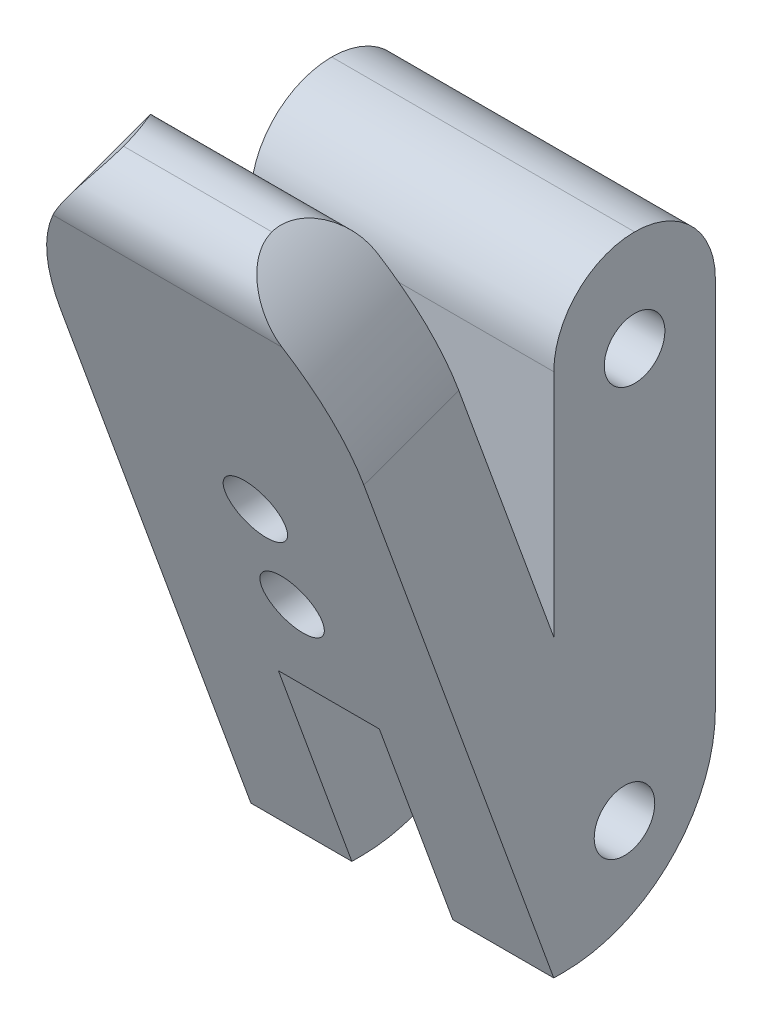
ISO-10303-21;
HEADER;
FILE_DESCRIPTION(('STEP AP214'),'2;1');
FILE_NAME('part.step','',(''),(''),'','','');
FILE_SCHEMA(('AUTOMOTIVE_DESIGN { 1 0 10303 214 1 1 1 1 }'));
ENDSEC;
DATA;
#1=APPLICATION_CONTEXT('core data for automotive mechanical design processes');
#2=APPLICATION_PROTOCOL_DEFINITION('international standard','automotive_design',2000,#1);
#3=PRODUCT_CONTEXT('',#1,'mechanical');
#4=PRODUCT('Part','Part','',(#3));
#5=PRODUCT_RELATED_PRODUCT_CATEGORY('part','',(#4));
#6=PRODUCT_DEFINITION_FORMATION('','',#4);
#7=PRODUCT_DEFINITION_CONTEXT('part definition',#1,'design');
#8=PRODUCT_DEFINITION('design','',#6,#7);
#9=PRODUCT_DEFINITION_SHAPE('','',#8);
#10=(LENGTH_UNIT() NAMED_UNIT(*) SI_UNIT(.MILLI.,.METRE.));
#11=(NAMED_UNIT(*) PLANE_ANGLE_UNIT() SI_UNIT($,.RADIAN.));
#12=(NAMED_UNIT(*) SI_UNIT($,.STERADIAN.) SOLID_ANGLE_UNIT());
#13=UNCERTAINTY_MEASURE_WITH_UNIT(LENGTH_MEASURE(1.E-05),#10,'distance_accuracy_value','');
#14=(GEOMETRIC_REPRESENTATION_CONTEXT(3) GLOBAL_UNCERTAINTY_ASSIGNED_CONTEXT((#13)) GLOBAL_UNIT_ASSIGNED_CONTEXT((#10,
#11,#12)) REPRESENTATION_CONTEXT('',''));
#15=CARTESIAN_POINT('',(0.,0.,0.));
#16=DIRECTION('',(0.,0.,1.));
#17=DIRECTION('',(1.,0.,0.));
#18=AXIS2_PLACEMENT_3D('',#15,#16,#17);
#19=CARTESIAN_POINT('',(30.,-60.,-1.));
#20=DIRECTION('',(0.,-1.,0.));
#21=DIRECTION('',(1.,0.,0.));
#22=AXIS2_PLACEMENT_3D('',#19,#20,#21);
#23=PLANE('',#22);
#24=DIRECTION('',(0.,0.,1.));
#25=VECTOR('',#24,1.);
#26=CARTESIAN_POINT('',(0.,-60.,-1.));
#27=LINE('',#26,#25);
#28=CARTESIAN_POINT('',(0.,-60.,14.));
#29=VERTEX_POINT('',#28);
#30=CARTESIAN_POINT('',(0.,-60.,15.));
#31=VERTEX_POINT('',#30);
#32=EDGE_CURVE('E251',#29,#31,#27,.T.);
#33=ORIENTED_EDGE('',*,*,#32,.F.);
#34=DIRECTION('',(1.,0.,0.));
#35=VECTOR('',#34,1.);
#36=CARTESIAN_POINT('',(30.,-60.,14.));
#37=LINE('',#36,#35);
#38=CARTESIAN_POINT('',(10.,-60.,14.));
#39=VERTEX_POINT('',#38);
#40=EDGE_CURVE('E291',#29,#39,#37,.T.);
#41=ORIENTED_EDGE('',*,*,#40,.T.);
#42=DIRECTION('',(0.,0.,-1.));
#43=VECTOR('',#42,1.);
#44=CARTESIAN_POINT('',(10.,-60.,29.));
#45=LINE('',#44,#43);
#46=CARTESIAN_POINT('',(10.,-60.,15.));
#47=VERTEX_POINT('',#46);
#48=EDGE_CURVE('E190',#47,#39,#45,.T.);
#49=ORIENTED_EDGE('',*,*,#48,.F.);
#50=DIRECTION('',(1.,0.,0.));
#51=VECTOR('',#50,1.);
#52=CARTESIAN_POINT('',(30.,-60.,15.));
#53=LINE('',#52,#51);
#54=EDGE_CURVE('E241',#31,#47,#53,.T.);
#55=ORIENTED_EDGE('',*,*,#54,.F.);
#56=EDGE_LOOP('',(#33,#41,#49,#55));
#57=FACE_BOUND('',#56,.T.);
#58=ADVANCED_FACE('F32',(#57),#23,.T.);
#59=CARTESIAN_POINT('',(49.,-50.,8.));
#60=DIRECTION('',(-1.,0.,0.));
#61=DIRECTION('',(0.,0.,1.));
#62=AXIS2_PLACEMENT_3D('',#59,#60,#61);
#63=CYLINDRICAL_SURFACE('',#62,3.);
#64=CARTESIAN_POINT('',(10.,-50.,8.));
#65=DIRECTION('',(-1.,0.,0.));
#66=DIRECTION('',(0.,-1.,0.));
#67=AXIS2_PLACEMENT_3D('',#64,#65,#66);
#68=CIRCLE('',#67,3.);
#69=CARTESIAN_POINT('',(10.,-53.,8.));
#70=VERTEX_POINT('',#69);
#71=EDGE_CURVE('E196',#70,#70,#68,.F.);
#72=ORIENTED_EDGE('',*,*,#71,.T.);
#73=EDGE_LOOP('',(#72));
#74=FACE_BOUND('',#73,.T.);
#75=CARTESIAN_POINT('',(0.,-50.,8.));
#76=DIRECTION('',(-1.,0.,0.));
#77=DIRECTION('',(0.,0.,1.));
#78=AXIS2_PLACEMENT_3D('',#75,#76,#77);
#79=CIRCLE('',#78,3.);
#80=CARTESIAN_POINT('',(0.,-50.,11.));
#81=VERTEX_POINT('',#80);
#82=EDGE_CURVE('E200',#81,#81,#79,.T.);
#83=ORIENTED_EDGE('',*,*,#82,.T.);
#84=EDGE_LOOP('',(#83));
#85=FACE_BOUND('',#84,.T.);
#86=ADVANCED_FACE('F435',(#74,#85),#63,.F.);
#87=CARTESIAN_POINT('',(0.,-60.,-1.));
#88=DIRECTION('',(-1.,0.,0.));
#89=DIRECTION('',(0.,0.,1.));
#90=AXIS2_PLACEMENT_3D('',#87,#88,#89);
#91=PLANE('',#90);
#92=ORIENTED_EDGE('',*,*,#82,.F.);
#93=EDGE_LOOP('',(#92));
#94=FACE_BOUND('',#93,.T.);
#95=DIRECTION('',(0.,0.939692620785908,0.342020143325669));
#96=VECTOR('',#95,1.);
#97=CARTESIAN_POINT('',(0.,-60.,15.));
#98=LINE('',#97,#96);
#99=CARTESIAN_POINT('',(0.,-8.31690585677505,33.8111078829118));
#100=VERTEX_POINT('',#99);
#101=EDGE_CURVE('E227',#31,#100,#98,.T.);
#102=ORIENTED_EDGE('',*,*,#101,.T.);
#103=DIRECTION('',(0.,-0.342020143325669,0.939692620785908));
#104=VECTOR('',#103,1.);
#105=CARTESIAN_POINT('',(0.,-4.89670442351835,24.4141816750527));
#106=LINE('',#105,#104);
#107=CARTESIAN_POINT('',(0.,-4.89670442351836,24.4141816750527));
#108=VERTEX_POINT('',#107);
#109=EDGE_CURVE('E313',#100,#108,#106,.F.);
#110=ORIENTED_EDGE('',*,*,#109,.T.);
#111=DIRECTION('',(0.,0.939692620785908,0.342020143325669));
#112=VECTOR('',#111,1.);
#113=CARTESIAN_POINT('',(0.,-56.5797985667433,5.6030737921409));
#114=LINE('',#113,#112);
#115=CARTESIAN_POINT('',(0.,-30.7619559983692,15.));
#116=VERTEX_POINT('',#115);
#117=EDGE_CURVE('E226',#116,#108,#114,.T.);
#118=ORIENTED_EDGE('',*,*,#117,.F.);
#119=DIRECTION('',(0.,-1.,0.));
#120=VECTOR('',#119,1.);
#121=CARTESIAN_POINT('',(0.,-60.,15.));
#122=LINE('',#121,#120);
#123=CARTESIAN_POINT('',(0.,-8.,15.));
#124=VERTEX_POINT('',#123);
#125=EDGE_CURVE('E238',#124,#116,#122,.T.);
#126=ORIENTED_EDGE('',*,*,#125,.F.);
#127=CARTESIAN_POINT('',(0.,-8.,6.99999999999999));
#128=DIRECTION('',(-1.,0.,0.));
#129=DIRECTION('',(0.,0.,1.));
#130=AXIS2_PLACEMENT_3D('',#127,#128,#129);
#131=CIRCLE('',#130,8.);
#132=CARTESIAN_POINT('',(0.,0.,7.));
#133=VERTEX_POINT('',#132);
#134=EDGE_CURVE('E263',#124,#133,#131,.T.);
#135=ORIENTED_EDGE('',*,*,#134,.T.);
#136=CARTESIAN_POINT('',(0.,-8.,7.));
#137=DIRECTION('',(-1.,0.,0.));
#138=DIRECTION('',(0.,0.,1.));
#139=AXIS2_PLACEMENT_3D('',#136,#137,#138);
#140=CIRCLE('',#139,8.);
#141=CARTESIAN_POINT('',(0.,-8.,-1.));
#142=VERTEX_POINT('',#141);
#143=EDGE_CURVE('E261',#133,#142,#140,.T.);
#144=ORIENTED_EDGE('',*,*,#143,.T.);
#145=DIRECTION('',(0.,-1.,0.));
#146=VECTOR('',#145,1.);
#147=CARTESIAN_POINT('',(0.,-60.,-1.));
#148=LINE('',#147,#146);
#149=CARTESIAN_POINT('',(0.,-45.,-1.));
#150=VERTEX_POINT('',#149);
#151=EDGE_CURVE('E246',#142,#150,#148,.T.);
#152=ORIENTED_EDGE('',*,*,#151,.T.);
#153=CARTESIAN_POINT('',(0.,-45.,14.));
#154=DIRECTION('',(-1.,0.,0.));
#155=DIRECTION('',(0.,0.,1.));
#156=AXIS2_PLACEMENT_3D('',#153,#154,#155);
#157=CIRCLE('',#156,15.);
#158=EDGE_CURVE('E299',#150,#29,#157,.T.);
#159=ORIENTED_EDGE('',*,*,#158,.T.);
#160=ORIENTED_EDGE('',*,*,#32,.T.);
#161=EDGE_LOOP('',(#102,#110,#118,#126,#135,#144,#152,#159,#160));
#162=FACE_BOUND('',#161,.T.);
#163=CARTESIAN_POINT('',(0.,-10.,6.99999999999999));
#164=DIRECTION('',(-1.,0.,0.));
#165=DIRECTION('',(0.,0.,1.));
#166=AXIS2_PLACEMENT_3D('',#163,#164,#165);
#167=CIRCLE('',#166,3.);
#168=CARTESIAN_POINT('',(0.,-10.,9.99999999999999));
#169=VERTEX_POINT('',#168);
#170=EDGE_CURVE('E234',#169,#169,#167,.T.);
#171=ORIENTED_EDGE('',*,*,#170,.F.);
#172=EDGE_LOOP('',(#171));
#173=FACE_BOUND('',#172,.T.);
#174=ADVANCED_FACE('F396',(#94,#162,#173),#91,.T.);
#175=CARTESIAN_POINT('',(30.,0.,-1.));
#176=DIRECTION('',(1.,0.,0.));
#177=DIRECTION('',(0.,1.,0.));
#178=AXIS2_PLACEMENT_3D('',#175,#176,#177);
#179=PLANE('',#178);
#180=CARTESIAN_POINT('',(30.,-50.,8.));
#181=DIRECTION('',(1.,0.,0.));
#182=DIRECTION('',(0.,1.,0.));
#183=AXIS2_PLACEMENT_3D('',#180,#181,#182);
#184=CIRCLE('',#183,3.);
#185=CARTESIAN_POINT('',(30.,-47.,8.));
#186=VERTEX_POINT('',#185);
#187=EDGE_CURVE('E203',#186,#186,#184,.T.);
#188=ORIENTED_EDGE('',*,*,#187,.F.);
#189=EDGE_LOOP('',(#188));
#190=FACE_BOUND('',#189,.T.);
#191=DIRECTION('',(0.,-0.939692620785908,-0.342020143325669));
#192=VECTOR('',#191,1.);
#193=CARTESIAN_POINT('',(30.,-56.5797985667433,5.6030737921409));
#194=LINE('',#193,#192);
#195=CARTESIAN_POINT('',(30.,-4.89670442351836,24.4141816750527));
#196=VERTEX_POINT('',#195);
#197=CARTESIAN_POINT('',(30.,-30.7619559983692,15.));
#198=VERTEX_POINT('',#197);
#199=EDGE_CURVE('E224',#196,#198,#194,.T.);
#200=ORIENTED_EDGE('',*,*,#199,.F.);
#201=DIRECTION('',(0.,-0.342020143325669,0.939692620785908));
#202=VECTOR('',#201,1.);
#203=CARTESIAN_POINT('',(30.,-8.31690585677505,33.8111078829118));
#204=LINE('',#203,#202);
#205=CARTESIAN_POINT('',(30.,-8.31690585677505,33.8111078829118));
#206=VERTEX_POINT('',#205);
#207=EDGE_CURVE('E320',#196,#206,#204,.T.);
#208=ORIENTED_EDGE('',*,*,#207,.T.);
#209=DIRECTION('',(0.,-0.939692620785908,-0.342020143325669));
#210=VECTOR('',#209,1.);
#211=CARTESIAN_POINT('',(30.,-60.,15.));
#212=LINE('',#211,#210);
#213=CARTESIAN_POINT('',(30.,-60.,15.));
#214=VERTEX_POINT('',#213);
#215=EDGE_CURVE('E223',#206,#214,#212,.T.);
#216=ORIENTED_EDGE('',*,*,#215,.T.);
#217=DIRECTION('',(0.,0.,1.));
#218=VECTOR('',#217,1.);
#219=CARTESIAN_POINT('',(30.,-60.,-1.));
#220=LINE('',#219,#218);
#221=CARTESIAN_POINT('',(30.,-60.,14.));
#222=VERTEX_POINT('',#221);
#223=EDGE_CURVE('E252',#222,#214,#220,.T.);
#224=ORIENTED_EDGE('',*,*,#223,.F.);
#225=CARTESIAN_POINT('',(30.,-45.,14.));
#226=DIRECTION('',(1.,0.,0.));
#227=DIRECTION('',(0.,1.,0.));
#228=AXIS2_PLACEMENT_3D('',#225,#226,#227);
#229=CIRCLE('',#228,15.);
#230=CARTESIAN_POINT('',(30.,-45.,-1.));
#231=VERTEX_POINT('',#230);
#232=EDGE_CURVE('E304',#222,#231,#229,.T.);
#233=ORIENTED_EDGE('',*,*,#232,.T.);
#234=DIRECTION('',(0.,1.,0.));
#235=VECTOR('',#234,1.);
#236=CARTESIAN_POINT('',(30.,0.,-1.));
#237=LINE('',#236,#235);
#238=CARTESIAN_POINT('',(30.,-8.,-1.));
#239=VERTEX_POINT('',#238);
#240=EDGE_CURVE('E249',#231,#239,#237,.T.);
#241=ORIENTED_EDGE('',*,*,#240,.T.);
#242=CARTESIAN_POINT('',(30.,-8.,7.));
#243=DIRECTION('',(1.,0.,0.));
#244=DIRECTION('',(0.,1.,0.));
#245=AXIS2_PLACEMENT_3D('',#242,#243,#244);
#246=CIRCLE('',#245,8.);
#247=CARTESIAN_POINT('',(30.,0.,7.));
#248=VERTEX_POINT('',#247);
#249=EDGE_CURVE('E265',#239,#248,#246,.T.);
#250=ORIENTED_EDGE('',*,*,#249,.T.);
#251=CARTESIAN_POINT('',(30.,-8.,6.99999999999999));
#252=DIRECTION('',(1.,0.,0.));
#253=DIRECTION('',(0.,1.,0.));
#254=AXIS2_PLACEMENT_3D('',#251,#252,#253);
#255=CIRCLE('',#254,8.);
#256=CARTESIAN_POINT('',(30.,-8.,15.));
#257=VERTEX_POINT('',#256);
#258=EDGE_CURVE('E267',#248,#257,#255,.T.);
#259=ORIENTED_EDGE('',*,*,#258,.T.);
#260=DIRECTION('',(0.,1.,0.));
#261=VECTOR('',#260,1.);
#262=CARTESIAN_POINT('',(30.,0.,15.));
#263=LINE('',#262,#261);
#264=EDGE_CURVE('E244',#198,#257,#263,.T.);
#265=ORIENTED_EDGE('',*,*,#264,.F.);
#266=EDGE_LOOP('',(#200,#208,#216,#224,#233,#241,#250,#259,#265));
#267=FACE_BOUND('',#266,.T.);
#268=CARTESIAN_POINT('',(30.,-10.,6.99999999999999));
#269=DIRECTION('',(1.,0.,0.));
#270=DIRECTION('',(0.,1.,0.));
#271=AXIS2_PLACEMENT_3D('',#268,#269,#270);
#272=CIRCLE('',#271,3.);
#273=CARTESIAN_POINT('',(30.,-7.,6.99999999999999));
#274=VERTEX_POINT('',#273);
#275=EDGE_CURVE('E237',#274,#274,#272,.T.);
#276=ORIENTED_EDGE('',*,*,#275,.F.);
#277=EDGE_LOOP('',(#276));
#278=FACE_BOUND('',#277,.T.);
#279=ADVANCED_FACE('F379',(#190,#267,#278),#179,.T.);
#280=DIRECTION('',(0.,0.,-1.));
#281=VECTOR('',#280,1.);
#282=CARTESIAN_POINT('',(20.,-60.,29.));
#283=LINE('',#282,#281);
#284=CARTESIAN_POINT('',(20.,-60.,15.));
#285=VERTEX_POINT('',#284);
#286=CARTESIAN_POINT('',(20.,-60.,14.));
#287=VERTEX_POINT('',#286);
#288=EDGE_CURVE('E168',#285,#287,#283,.T.);
#289=ORIENTED_EDGE('',*,*,#288,.T.);
#290=DIRECTION('',(1.,0.,0.));
#291=VECTOR('',#290,1.);
#292=CARTESIAN_POINT('',(30.,-60.,14.));
#293=LINE('',#292,#291);
#294=EDGE_CURVE('E301',#287,#222,#293,.T.);
#295=ORIENTED_EDGE('',*,*,#294,.T.);
#296=ORIENTED_EDGE('',*,*,#223,.T.);
#297=EDGE_CURVE('E240',#285,#214,#53,.T.);
#298=ORIENTED_EDGE('',*,*,#297,.F.);
#299=EDGE_LOOP('',(#289,#295,#296,#298));
#300=FACE_BOUND('',#299,.T.);
#301=ADVANCED_FACE('F422',(#300),#23,.T.);
#302=CARTESIAN_POINT('',(0.,0.,-1.));
#303=DIRECTION('',(0.,0.,-1.));
#304=DIRECTION('',(-1.,0.,0.));
#305=AXIS2_PLACEMENT_3D('',#302,#303,#304);
#306=PLANE('',#305);
#307=DIRECTION('',(0.,1.,0.));
#308=VECTOR('',#307,1.);
#309=CARTESIAN_POINT('',(10.,-40.,-1.));
#310=LINE('',#309,#308);
#311=CARTESIAN_POINT('',(10.,-45.,-1.));
#312=VERTEX_POINT('',#311);
#313=CARTESIAN_POINT('',(10.,-40.,-1.));
#314=VERTEX_POINT('',#313);
#315=EDGE_CURVE('E169',#312,#314,#310,.T.);
#316=ORIENTED_EDGE('',*,*,#315,.F.);
#317=DIRECTION('',(1.,0.,0.));
#318=VECTOR('',#317,1.);
#319=CARTESIAN_POINT('',(0.,-45.,-1.));
#320=LINE('',#319,#318);
#321=EDGE_CURVE('E297',#312,#150,#320,.F.);
#322=ORIENTED_EDGE('',*,*,#321,.T.);
#323=ORIENTED_EDGE('',*,*,#151,.F.);
#324=DIRECTION('',(-1.,0.,0.));
#325=VECTOR('',#324,1.);
#326=CARTESIAN_POINT('',(0.,-8.,-1.));
#327=LINE('',#326,#325);
#328=EDGE_CURVE('E270',#142,#239,#327,.F.);
#329=ORIENTED_EDGE('',*,*,#328,.T.);
#330=ORIENTED_EDGE('',*,*,#240,.F.);
#331=DIRECTION('',(1.,0.,0.));
#332=VECTOR('',#331,1.);
#333=CARTESIAN_POINT('',(0.,-45.,-1.));
#334=LINE('',#333,#332);
#335=CARTESIAN_POINT('',(20.,-45.,-1.));
#336=VERTEX_POINT('',#335);
#337=EDGE_CURVE('E184',#231,#336,#334,.F.);
#338=ORIENTED_EDGE('',*,*,#337,.T.);
#339=DIRECTION('',(0.,-1.,0.));
#340=VECTOR('',#339,1.);
#341=CARTESIAN_POINT('',(20.,-40.,-1.));
#342=LINE('',#341,#340);
#343=CARTESIAN_POINT('',(20.,-40.,-1.));
#344=VERTEX_POINT('',#343);
#345=EDGE_CURVE('E162',#344,#336,#342,.T.);
#346=ORIENTED_EDGE('',*,*,#345,.F.);
#347=DIRECTION('',(1.,0.,0.));
#348=VECTOR('',#347,1.);
#349=CARTESIAN_POINT('',(20.,-40.,-1.));
#350=LINE('',#349,#348);
#351=EDGE_CURVE('E173',#314,#344,#350,.T.);
#352=ORIENTED_EDGE('',*,*,#351,.F.);
#353=EDGE_LOOP('',(#316,#322,#323,#329,#330,#338,#346,#352));
#354=FACE_BOUND('',#353,.T.);
#355=CARTESIAN_POINT('',(15.,-20.,-1.));
#356=DIRECTION('',(0.,0.,-1.));
#357=DIRECTION('',(-1.,0.,0.));
#358=AXIS2_PLACEMENT_3D('',#355,#356,#357);
#359=CIRCLE('',#358,3.);
#360=CARTESIAN_POINT('',(12.,-20.,-1.));
#361=VERTEX_POINT('',#360);
#362=EDGE_CURVE('E204',#361,#361,#359,.T.);
#363=ORIENTED_EDGE('',*,*,#362,.F.);
#364=EDGE_LOOP('',(#363));
#365=FACE_BOUND('',#364,.T.);
#366=CARTESIAN_POINT('',(15.,-30.,-1.));
#367=DIRECTION('',(0.,0.,-1.));
#368=DIRECTION('',(-1.,0.,0.));
#369=AXIS2_PLACEMENT_3D('',#366,#367,#368);
#370=CIRCLE('',#369,3.);
#371=CARTESIAN_POINT('',(12.,-30.,-1.));
#372=VERTEX_POINT('',#371);
#373=EDGE_CURVE('E208',#372,#372,#370,.T.);
#374=ORIENTED_EDGE('',*,*,#373,.F.);
#375=EDGE_LOOP('',(#374));
#376=FACE_BOUND('',#375,.T.);
#377=ADVANCED_FACE('F180',(#354,#365,#376),#306,.T.);
#378=CARTESIAN_POINT('',(0.,0.,15.));
#379=DIRECTION('',(0.,0.,-1.));
#380=DIRECTION('',(-1.,0.,0.));
#381=AXIS2_PLACEMENT_3D('',#378,#379,#380);
#382=PLANE('',#381);
#383=CARTESIAN_POINT('',(15.,-20.,15.));
#384=DIRECTION('',(0.,0.,-1.));
#385=DIRECTION('',(-1.,0.,0.));
#386=AXIS2_PLACEMENT_3D('',#383,#384,#385);
#387=CIRCLE('',#386,3.);
#388=CARTESIAN_POINT('',(12.,-20.,15.));
#389=VERTEX_POINT('',#388);
#390=EDGE_CURVE('E220',#389,#389,#387,.T.);
#391=ORIENTED_EDGE('',*,*,#390,.T.);
#392=EDGE_LOOP('',(#391));
#393=FACE_BOUND('',#392,.T.);
#394=DIRECTION('',(1.,0.,0.));
#395=VECTOR('',#394,1.);
#396=CARTESIAN_POINT('',(0.,-30.7619559983692,15.));
#397=LINE('',#396,#395);
#398=CARTESIAN_POINT('',(12.0983757899154,-30.7619559983692,15.));
#399=VERTEX_POINT('',#398);
#400=EDGE_CURVE('E276',#116,#399,#397,.T.);
#401=ORIENTED_EDGE('',*,*,#400,.T.);
#402=CARTESIAN_POINT('',(15.,-30.,15.));
#403=DIRECTION('',(0.,0.,-1.));
#404=DIRECTION('',(-1.,0.,0.));
#405=AXIS2_PLACEMENT_3D('',#402,#403,#404);
#406=CIRCLE('',#405,3.);
#407=CARTESIAN_POINT('',(17.9016242100846,-30.7619559983692,15.));
#408=VERTEX_POINT('',#407);
#409=EDGE_CURVE('E213',#399,#408,#406,.T.);
#410=ORIENTED_EDGE('',*,*,#409,.T.);
#411=EDGE_CURVE('E273',#408,#198,#397,.T.);
#412=ORIENTED_EDGE('',*,*,#411,.T.);
#413=ORIENTED_EDGE('',*,*,#264,.T.);
#414=DIRECTION('',(-1.,0.,0.));
#415=VECTOR('',#414,1.);
#416=CARTESIAN_POINT('',(0.,-8.,15.));
#417=LINE('',#416,#415);
#418=EDGE_CURVE('E255',#257,#124,#417,.T.);
#419=ORIENTED_EDGE('',*,*,#418,.T.);
#420=ORIENTED_EDGE('',*,*,#125,.T.);
#421=EDGE_LOOP('',(#401,#410,#412,#413,#419,#420));
#422=FACE_BOUND('',#421,.T.);
#423=ADVANCED_FACE('F389',(#393,#422),#382,.F.);
#424=CARTESIAN_POINT('',(49.,-10.,6.99999999999999));
#425=DIRECTION('',(-1.,0.,0.));
#426=DIRECTION('',(0.,0.,1.));
#427=AXIS2_PLACEMENT_3D('',#424,#425,#426);
#428=CYLINDRICAL_SURFACE('',#427,3.);
#429=ORIENTED_EDGE('',*,*,#275,.T.);
#430=EDGE_LOOP('',(#429));
#431=FACE_BOUND('',#430,.T.);
#432=ORIENTED_EDGE('',*,*,#170,.T.);
#433=EDGE_LOOP('',(#432));
#434=FACE_BOUND('',#433,.T.);
#435=ADVANCED_FACE('F505',(#431,#434),#428,.F.);
#436=CARTESIAN_POINT('',(0.,-8.,7.));
#437=DIRECTION('',(-1.,0.,0.));
#438=DIRECTION('',(0.,0.,1.));
#439=AXIS2_PLACEMENT_3D('',#436,#437,#438);
#440=CYLINDRICAL_SURFACE('',#439,8.);
#441=DIRECTION('',(-1.,0.,0.));
#442=VECTOR('',#441,1.);
#443=CARTESIAN_POINT('',(0.,0.,7.));
#444=LINE('',#443,#442);
#445=EDGE_CURVE('E230',#248,#133,#444,.T.);
#446=ORIENTED_EDGE('',*,*,#445,.F.);
#447=ORIENTED_EDGE('',*,*,#249,.F.);
#448=ORIENTED_EDGE('',*,*,#328,.F.);
#449=ORIENTED_EDGE('',*,*,#143,.F.);
#450=EDGE_LOOP('',(#446,#447,#448,#449));
#451=FACE_BOUND('',#450,.T.);
#452=ADVANCED_FACE('F415',(#451),#440,.T.);
#453=CARTESIAN_POINT('',(0.,-8.,6.99999999999999));
#454=DIRECTION('',(1.,0.,0.));
#455=DIRECTION('',(0.,0.,-1.));
#456=AXIS2_PLACEMENT_3D('',#453,#454,#455);
#457=CYLINDRICAL_SURFACE('',#456,8.);
#458=ORIENTED_EDGE('',*,*,#258,.F.);
#459=ORIENTED_EDGE('',*,*,#445,.T.);
#460=ORIENTED_EDGE('',*,*,#134,.F.);
#461=ORIENTED_EDGE('',*,*,#418,.F.);
#462=EDGE_LOOP('',(#458,#459,#460,#461));
#463=FACE_BOUND('',#462,.T.);
#464=ADVANCED_FACE('F521',(#463),#457,.T.);
#465=CARTESIAN_POINT('',(0.,-8.41937234582304,23.1320354061294));
#466=DIRECTION('',(0.,0.342020143325669,-0.939692620785908));
#467=DIRECTION('',(0.,0.939692620785908,0.342020143325669));
#468=AXIS2_PLACEMENT_3D('',#465,#466,#467);
#469=PLANE('',#468);
#470=CARTESIAN_POINT('',(25.,-4.89670442351835,24.4141816750527));
#471=DIRECTION('',(0.,0.342020143325669,-0.939692620785908));
#472=DIRECTION('',(0.,0.939692620785908,0.342020143325669));
#473=AXIS2_PLACEMENT_3D('',#470,#471,#472);
#474=CIRCLE('',#473,25.);
#475=CARTESIAN_POINT('',(3.64561573347615,7.31894807363097,28.8603155761547));
#476=VERTEX_POINT('',#475);
#477=EDGE_CURVE('E318',#108,#476,#474,.T.);
#478=ORIENTED_EDGE('',*,*,#477,.T.);
#479=DIRECTION('',(-1.,0.,0.));
#480=VECTOR('',#479,1.);
#481=CARTESIAN_POINT('',(22.3497397319037,7.31894807363097,28.8603155761547));
#482=LINE('',#481,#480);
#483=CARTESIAN_POINT('',(26.3543842665238,7.31894807363097,28.8603155761547));
#484=VERTEX_POINT('',#483);
#485=EDGE_CURVE('E11',#476,#484,#482,.F.);
#486=ORIENTED_EDGE('',*,*,#485,.T.);
#487=CARTESIAN_POINT('',(4.99999999999999,-4.89670442351836,24.4141816750527));
#488=DIRECTION('',(0.,0.342020143325669,-0.939692620785908));
#489=DIRECTION('',(0.,0.939692620785908,0.342020143325669));
#490=AXIS2_PLACEMENT_3D('',#487,#488,#489);
#491=CIRCLE('',#490,25.);
#492=EDGE_CURVE('E316',#484,#196,#491,.T.);
#493=ORIENTED_EDGE('',*,*,#492,.T.);
#494=ORIENTED_EDGE('',*,*,#199,.T.);
#495=ORIENTED_EDGE('',*,*,#411,.F.);
#496=CARTESIAN_POINT('',(15.,-30.,15.277329303227));
#497=DIRECTION('',(0.,0.342020143325669,-0.939692620785908));
#498=DIRECTION('',(0.,-0.939692620785908,-0.342020143325669));
#499=AXIS2_PLACEMENT_3D('',#496,#497,#498);
#500=ELLIPSE('',#499,3.19253331742774,3.);
#501=EDGE_CURVE('E211',#399,#408,#500,.T.);
#502=ORIENTED_EDGE('',*,*,#501,.F.);
#503=ORIENTED_EDGE('',*,*,#400,.F.);
#504=ORIENTED_EDGE('',*,*,#117,.T.);
#505=EDGE_LOOP('',(#478,#486,#493,#494,#495,#502,#503,#504));
#506=FACE_BOUND('',#505,.T.);
#507=CARTESIAN_POINT('',(15.,-20.,18.917031645889));
#508=DIRECTION('',(0.,0.342020143325669,-0.939692620785908));
#509=DIRECTION('',(0.,-0.939692620785908,-0.342020143325669));
#510=AXIS2_PLACEMENT_3D('',#507,#508,#509);
#511=ELLIPSE('',#510,3.19253331742774,3.);
#512=CARTESIAN_POINT('',(15.,-23.,17.8251209430904));
#513=VERTEX_POINT('',#512);
#514=EDGE_CURVE('E217',#513,#513,#511,.T.);
#515=ORIENTED_EDGE('',*,*,#514,.F.);
#516=EDGE_LOOP('',(#515));
#517=FACE_BOUND('',#516,.T.);
#518=ADVANCED_FACE('F385',(#506,#517),#469,.T.);
#519=CARTESIAN_POINT('',(0.,-11.8395737790797,32.5289616139885));
#520=DIRECTION('',(0.,0.342020143325669,-0.939692620785908));
#521=DIRECTION('',(0.,0.939692620785908,0.342020143325669));
#522=AXIS2_PLACEMENT_3D('',#519,#520,#521);
#523=PLANE('',#522);
#524=CARTESIAN_POINT('',(15.,-20.,29.5588093706481));
#525=DIRECTION('',(0.,0.342020143325669,-0.939692620785908));
#526=DIRECTION('',(0.,-0.939692620785908,-0.342020143325669));
#527=AXIS2_PLACEMENT_3D('',#524,#525,#526);
#528=ELLIPSE('',#527,3.19253331742774,3.);
#529=CARTESIAN_POINT('',(15.,-23.,28.4668986678495));
#530=VERTEX_POINT('',#529);
#531=EDGE_CURVE('E216',#530,#530,#528,.T.);
#532=ORIENTED_EDGE('',*,*,#531,.T.);
#533=EDGE_LOOP('',(#532));
#534=FACE_BOUND('',#533,.T.);
#535=CARTESIAN_POINT('',(15.,-30.,25.9191070279861));
#536=DIRECTION('',(0.,0.342020143325669,-0.939692620785908));
#537=DIRECTION('',(0.,-0.939692620785908,-0.342020143325669));
#538=AXIS2_PLACEMENT_3D('',#535,#536,#537);
#539=ELLIPSE('',#538,3.19253331742774,3.);
#540=CARTESIAN_POINT('',(15.,-33.,24.8271963251875));
#541=VERTEX_POINT('',#540);
#542=EDGE_CURVE('E207',#541,#541,#539,.T.);
#543=ORIENTED_EDGE('',*,*,#542,.T.);
#544=EDGE_LOOP('',(#543));
#545=FACE_BOUND('',#544,.T.);
#546=CARTESIAN_POINT('',(4.99999999999999,-8.31690585677505,33.8111078829118));
#547=DIRECTION('',(0.,0.342020143325669,-0.939692620785908));
#548=DIRECTION('',(0.,0.939692620785908,0.342020143325669));
#549=AXIS2_PLACEMENT_3D('',#546,#547,#548);
#550=CIRCLE('',#549,25.);
#551=CARTESIAN_POINT('',(26.3543842665238,3.89874664037428,38.2572417840138));
#552=VERTEX_POINT('',#551);
#553=EDGE_CURVE('E308',#206,#552,#550,.F.);
#554=ORIENTED_EDGE('',*,*,#553,.T.);
#555=DIRECTION('',(-1.,0.,0.));
#556=VECTOR('',#555,1.);
#557=CARTESIAN_POINT('',(0.,3.89874664037428,38.2572417840138));
#558=LINE('',#557,#556);
#559=CARTESIAN_POINT('',(3.64561573347615,3.89874664037428,38.2572417840138));
#560=VERTEX_POINT('',#559);
#561=EDGE_CURVE('E322',#552,#560,#558,.T.);
#562=ORIENTED_EDGE('',*,*,#561,.T.);
#563=CARTESIAN_POINT('',(25.,-8.31690585677505,33.8111078829118));
#564=DIRECTION('',(0.,0.342020143325669,-0.939692620785908));
#565=DIRECTION('',(0.,0.939692620785908,0.342020143325669));
#566=AXIS2_PLACEMENT_3D('',#563,#564,#565);
#567=CIRCLE('',#566,25.);
#568=EDGE_CURVE('E311',#560,#100,#567,.F.);
#569=ORIENTED_EDGE('',*,*,#568,.T.);
#570=ORIENTED_EDGE('',*,*,#101,.F.);
#571=ORIENTED_EDGE('',*,*,#54,.T.);
#572=DIRECTION('',(0.,0.939692620785908,0.342020143325669));
#573=VECTOR('',#572,1.);
#574=CARTESIAN_POINT('',(10.,-11.8395737790797,32.5289616139885));
#575=LINE('',#574,#573);
#576=CARTESIAN_POINT('',(10.,-40.,22.279404685324));
#577=VERTEX_POINT('',#576);
#578=EDGE_CURVE('E197',#47,#577,#575,.T.);
#579=ORIENTED_EDGE('',*,*,#578,.T.);
#580=DIRECTION('',(1.,0.,0.));
#581=VECTOR('',#580,1.);
#582=CARTESIAN_POINT('',(0.,-40.,22.279404685324));
#583=LINE('',#582,#581);
#584=CARTESIAN_POINT('',(20.,-40.,22.279404685324));
#585=VERTEX_POINT('',#584);
#586=EDGE_CURVE('E279',#577,#585,#583,.T.);
#587=ORIENTED_EDGE('',*,*,#586,.T.);
#588=DIRECTION('',(0.,-0.939692620785908,-0.342020143325669));
#589=VECTOR('',#588,1.);
#590=CARTESIAN_POINT('',(20.,-11.8395737790797,32.5289616139885));
#591=LINE('',#590,#589);
#592=EDGE_CURVE('E165',#585,#285,#591,.T.);
#593=ORIENTED_EDGE('',*,*,#592,.T.);
#594=ORIENTED_EDGE('',*,*,#297,.T.);
#595=ORIENTED_EDGE('',*,*,#215,.F.);
#596=EDGE_LOOP('',(#554,#562,#569,#570,#571,#579,#587,#593,#594,#595));
#597=FACE_BOUND('',#596,.T.);
#598=ADVANCED_FACE('F372',(#534,#545,#597),#523,.F.);
#599=CARTESIAN_POINT('',(15.,-30.,37.));
#600=DIRECTION('',(0.,0.,-1.));
#601=DIRECTION('',(-1.,0.,0.));
#602=AXIS2_PLACEMENT_3D('',#599,#600,#601);
#603=CYLINDRICAL_SURFACE('',#602,3.);
#604=ORIENTED_EDGE('',*,*,#373,.T.);
#605=EDGE_LOOP('',(#604));
#606=FACE_BOUND('',#605,.T.);
#607=ORIENTED_EDGE('',*,*,#542,.F.);
#608=EDGE_LOOP('',(#607));
#609=FACE_BOUND('',#608,.T.);
#610=ORIENTED_EDGE('',*,*,#501,.T.);
#611=ORIENTED_EDGE('',*,*,#409,.F.);
#612=EDGE_LOOP('',(#610,#611));
#613=FACE_BOUND('',#612,.T.);
#614=ADVANCED_FACE('F392',(#606,#609,#613),#603,.F.);
#615=CARTESIAN_POINT('',(15.,-20.,37.));
#616=DIRECTION('',(0.,0.,-1.));
#617=DIRECTION('',(-1.,0.,0.));
#618=AXIS2_PLACEMENT_3D('',#615,#616,#617);
#619=CYLINDRICAL_SURFACE('',#618,3.);
#620=ORIENTED_EDGE('',*,*,#514,.T.);
#621=EDGE_LOOP('',(#620));
#622=FACE_BOUND('',#621,.T.);
#623=ORIENTED_EDGE('',*,*,#531,.F.);
#624=EDGE_LOOP('',(#623));
#625=FACE_BOUND('',#624,.T.);
#626=ADVANCED_FACE('F457',(#622,#625),#619,.F.);
#627=ORIENTED_EDGE('',*,*,#362,.T.);
#628=EDGE_LOOP('',(#627));
#629=FACE_BOUND('',#628,.T.);
#630=ORIENTED_EDGE('',*,*,#390,.F.);
#631=EDGE_LOOP('',(#630));
#632=FACE_BOUND('',#631,.T.);
#633=ADVANCED_FACE('F451',(#629,#632),#619,.F.);
#634=CARTESIAN_POINT('',(20.,-50.,8.));
#635=DIRECTION('',(1.,0.,0.));
#636=DIRECTION('',(0.,1.,0.));
#637=AXIS2_PLACEMENT_3D('',#634,#635,#636);
#638=CIRCLE('',#637,3.);
#639=CARTESIAN_POINT('',(20.,-47.,8.));
#640=VERTEX_POINT('',#639);
#641=EDGE_CURVE('E189',#640,#640,#638,.F.);
#642=ORIENTED_EDGE('',*,*,#641,.T.);
#643=EDGE_LOOP('',(#642));
#644=FACE_BOUND('',#643,.T.);
#645=ORIENTED_EDGE('',*,*,#187,.T.);
#646=EDGE_LOOP('',(#645));
#647=FACE_BOUND('',#646,.T.);
#648=ADVANCED_FACE('F441',(#644,#647),#63,.F.);
#649=CARTESIAN_POINT('',(20.,-40.,29.));
#650=DIRECTION('',(0.,1.,0.));
#651=DIRECTION('',(0.,0.,1.));
#652=AXIS2_PLACEMENT_3D('',#649,#650,#651);
#653=PLANE('',#652);
#654=DIRECTION('',(0.,0.,-1.));
#655=VECTOR('',#654,1.);
#656=CARTESIAN_POINT('',(10.,-40.,29.));
#657=LINE('',#656,#655);
#658=EDGE_CURVE('E176',#577,#314,#657,.T.);
#659=ORIENTED_EDGE('',*,*,#658,.T.);
#660=ORIENTED_EDGE('',*,*,#351,.T.);
#661=DIRECTION('',(0.,0.,-1.));
#662=VECTOR('',#661,1.);
#663=CARTESIAN_POINT('',(20.,-40.,29.));
#664=LINE('',#663,#662);
#665=EDGE_CURVE('E158',#585,#344,#664,.T.);
#666=ORIENTED_EDGE('',*,*,#665,.F.);
#667=ORIENTED_EDGE('',*,*,#586,.F.);
#668=EDGE_LOOP('',(#659,#660,#666,#667));
#669=FACE_BOUND('',#668,.T.);
#670=ADVANCED_FACE('F174',(#669),#653,.F.);
#671=CARTESIAN_POINT('',(10.,-40.,29.));
#672=DIRECTION('',(-1.,0.,0.));
#673=DIRECTION('',(0.,-1.,0.));
#674=AXIS2_PLACEMENT_3D('',#671,#672,#673);
#675=PLANE('',#674);
#676=ORIENTED_EDGE('',*,*,#71,.F.);
#677=EDGE_LOOP('',(#676));
#678=FACE_BOUND('',#677,.T.);
#679=ORIENTED_EDGE('',*,*,#48,.T.);
#680=CARTESIAN_POINT('',(10.,-45.,14.));
#681=DIRECTION('',(-1.,0.,0.));
#682=DIRECTION('',(0.,-1.,0.));
#683=AXIS2_PLACEMENT_3D('',#680,#681,#682);
#684=CIRCLE('',#683,15.);
#685=EDGE_CURVE('E294',#39,#312,#684,.F.);
#686=ORIENTED_EDGE('',*,*,#685,.T.);
#687=ORIENTED_EDGE('',*,*,#315,.T.);
#688=ORIENTED_EDGE('',*,*,#658,.F.);
#689=ORIENTED_EDGE('',*,*,#578,.F.);
#690=EDGE_LOOP('',(#679,#686,#687,#688,#689));
#691=FACE_BOUND('',#690,.T.);
#692=ADVANCED_FACE('F404',(#678,#691),#675,.F.);
#693=CARTESIAN_POINT('',(20.,-40.,29.));
#694=DIRECTION('',(1.,0.,0.));
#695=DIRECTION('',(0.,1.,0.));
#696=AXIS2_PLACEMENT_3D('',#693,#694,#695);
#697=PLANE('',#696);
#698=ORIENTED_EDGE('',*,*,#641,.F.);
#699=EDGE_LOOP('',(#698));
#700=FACE_BOUND('',#699,.T.);
#701=ORIENTED_EDGE('',*,*,#345,.T.);
#702=CARTESIAN_POINT('',(20.,-45.,14.));
#703=DIRECTION('',(1.,0.,0.));
#704=DIRECTION('',(0.,1.,0.));
#705=AXIS2_PLACEMENT_3D('',#702,#703,#704);
#706=CIRCLE('',#705,15.);
#707=EDGE_CURVE('E306',#336,#287,#706,.F.);
#708=ORIENTED_EDGE('',*,*,#707,.T.);
#709=ORIENTED_EDGE('',*,*,#288,.F.);
#710=ORIENTED_EDGE('',*,*,#592,.F.);
#711=ORIENTED_EDGE('',*,*,#665,.T.);
#712=EDGE_LOOP('',(#701,#708,#709,#710,#711));
#713=FACE_BOUND('',#712,.T.);
#714=ADVANCED_FACE('F160',(#700,#713),#697,.F.);
#715=CARTESIAN_POINT('',(30.,-45.,14.));
#716=DIRECTION('',(1.,0.,0.));
#717=DIRECTION('',(0.,1.,0.));
#718=AXIS2_PLACEMENT_3D('',#715,#716,#717);
#719=CYLINDRICAL_SURFACE('',#718,15.);
#720=ORIENTED_EDGE('',*,*,#158,.F.);
#721=ORIENTED_EDGE('',*,*,#321,.F.);
#722=ORIENTED_EDGE('',*,*,#685,.F.);
#723=ORIENTED_EDGE('',*,*,#40,.F.);
#724=EDGE_LOOP('',(#720,#721,#722,#723));
#725=FACE_BOUND('',#724,.T.);
#726=ADVANCED_FACE('F409',(#725),#719,.T.);
#727=CARTESIAN_POINT('',(30.,-45.,14.));
#728=DIRECTION('',(1.,0.,0.));
#729=DIRECTION('',(0.,1.,0.));
#730=AXIS2_PLACEMENT_3D('',#727,#728,#729);
#731=CYLINDRICAL_SURFACE('',#730,15.);
#732=ORIENTED_EDGE('',*,*,#707,.F.);
#733=ORIENTED_EDGE('',*,*,#337,.F.);
#734=ORIENTED_EDGE('',*,*,#232,.F.);
#735=ORIENTED_EDGE('',*,*,#294,.F.);
#736=EDGE_LOOP('',(#732,#733,#734,#735));
#737=FACE_BOUND('',#736,.T.);
#738=ADVANCED_FACE('F345',(#737),#731,.T.);
#739=CARTESIAN_POINT('',(4.99999999999999,3.84406172714795,0.399124047363787));
#740=DIRECTION('',(0.,0.342020143325669,-0.939692620785908));
#741=DIRECTION('',(0.,0.939692620785908,0.342020143325669));
#742=AXIS2_PLACEMENT_3D('',#739,#740,#741);
#743=CYLINDRICAL_SURFACE('',#742,25.);
#744=CARTESIAN_POINT('',(26.3543842665238,7.31894807363097,28.8603155761547));
#745=CARTESIAN_POINT('',(26.2436207945559,7.48997467700129,28.9225759469325));
#746=CARTESIAN_POINT('',(26.1305225479306,7.6561885154337,28.9936342286118));
#747=CARTESIAN_POINT('',(25.900789813214,7.97795209287642,29.1520222377046));
#748=CARTESIAN_POINT('',(25.784157170964,8.13350726453153,29.2393435902815));
#749=CARTESIAN_POINT('',(25.5482203991531,8.43328642886335,29.4291226844917));
#750=CARTESIAN_POINT('',(25.4289130073649,8.57749549547407,29.5315998702782));
#751=CARTESIAN_POINT('',(25.188892713797,8.85361107187494,29.7505562142925));
#752=CARTESIAN_POINT('',(25.0681796954639,8.98551655317219,29.8670365412244));
#753=CARTESIAN_POINT('',(24.8348801051652,9.22765897941832,30.1046553425224));
#754=CARTESIAN_POINT('',(24.7223048337522,9.33876194086526,30.2249243946113));
#755=CARTESIAN_POINT('',(24.4980851362553,9.54903668955006,30.4762861925496));
#756=CARTESIAN_POINT('',(24.3864407130301,9.64820844015794,30.6073789716267));
#757=CARTESIAN_POINT('',(24.165383093282,9.83385840423592,30.8798894705435));
#758=CARTESIAN_POINT('',(24.0559686424664,9.9203439330619,31.0213011690908));
#759=CARTESIAN_POINT('',(23.8408305883853,10.0797813351326,31.3141109022689));
#760=CARTESIAN_POINT('',(23.7351059020716,10.1527372072962,31.4655059681552));
#761=CARTESIAN_POINT('',(23.4802571863562,10.3151779529434,31.8520678362441));
#762=CARTESIAN_POINT('',(23.3342502988545,10.3961667168483,32.0929962817566));
#763=CARTESIAN_POINT('',(23.0615633284564,10.5217445142113,32.5943759299868));
#764=CARTESIAN_POINT('',(22.9348522108376,10.5663925106169,32.8547947567118));
#765=CARTESIAN_POINT('',(22.73647734961,10.6079326276882,33.3303410289746));
#766=CARTESIAN_POINT('',(22.6588538677185,10.6134307081016,33.5421530343586));
#767=CARTESIAN_POINT('',(22.5597988769783,10.6006741444917,33.8640568834451));
#768=CARTESIAN_POINT('',(22.5296945768084,10.5929360526814,33.9719669324329));
#769=CARTESIAN_POINT('',(22.4759015295428,10.5702161788539,34.1886027804061));
#770=CARTESIAN_POINT('',(22.4522111166353,10.5552362804961,34.2973283600287));
#771=CARTESIAN_POINT('',(22.4051524721066,10.511593670166,34.5510843083159));
#772=CARTESIAN_POINT('',(22.3845134049774,10.4800368697607,34.6961591956938));
#773=CARTESIAN_POINT('',(22.3637251743842,10.4227479959601,34.9122790234146));
#774=CARTESIAN_POINT('',(22.3584906161864,10.4019436988107,34.9842054569163));
#775=CARTESIAN_POINT('',(22.3514950302689,10.3570649405752,35.1272337612235));
#776=CARTESIAN_POINT('',(22.3497354209232,10.3329891484428,35.1983352835575));
#777=CARTESIAN_POINT('',(22.3497397319037,10.3073104609322,35.2688793967126));
#778=B_SPLINE_CURVE_WITH_KNOTS('',3,(#744,#745,#746,#747,#748,#749,#750,#751,#752,#753,#754,
#755,#756,#757,#758,#759,#760,#761,#762,#763,#764,#765,#766,#767,#768,#769,#770,#771,#772,#773,
#774,#775,#776,#777),.UNSPECIFIED.,.F.,.F.,(4,2,2,2,2,2,2,2,2,2,2,2,2,2,2,2,4),(0.,
0.638822277171702,1.27731649125928,1.91663708300006,2.55601106962498,3.15147069306271,
3.74693214457295,4.34204886914423,4.93698941557635,5.81324594748745,6.68807790184534,
7.36221268849636,7.69873671341779,8.03517325244612,8.48353594897293,8.70857414637942,
8.93370417892447),.UNSPECIFIED.);
#779=CARTESIAN_POINT('',(22.3497397319037,10.3073104609322,35.2688793967126));
#780=VERTEX_POINT('',#779);
#781=EDGE_CURVE('E54',#484,#780,#778,.T.);
#782=ORIENTED_EDGE('',*,*,#781,.T.);
#783=CARTESIAN_POINT('',(22.3497397319037,10.3073104609322,35.2688793967126));
#784=CARTESIAN_POINT('',(22.3496969995947,10.2684597785771,35.3757107236925));
#785=CARTESIAN_POINT('',(22.3537602147574,10.2259198225962,35.48116711916));
#786=CARTESIAN_POINT('',(22.3697691895047,10.1340767932758,35.6883423790603));
#787=CARTESIAN_POINT('',(22.3817063854399,10.0847811134754,35.7900651773718));
#788=CARTESIAN_POINT('',(22.4129728412797,9.98049702103501,35.9879930724663));
#789=CARTESIAN_POINT('',(22.4322244149897,9.92557272062471,36.0842443357929));
#790=CARTESIAN_POINT('',(22.4775636175971,9.81027872527425,36.2717293784593));
#791=CARTESIAN_POINT('',(22.5036527305054,9.74990785008388,36.362962063366));
#792=CARTESIAN_POINT('',(22.5909723753978,9.56215094538673,36.6276458097792));
#793=CARTESIAN_POINT('',(22.6614258280234,9.42758032705216,36.7930929280121));
#794=CARTESIAN_POINT('',(22.8215100635603,9.14391475813841,37.1010138193438));
#795=CARTESIAN_POINT('',(22.9111992667769,8.99477633278277,37.2434152362689));
#796=CARTESIAN_POINT('',(23.1505172205462,8.61243651529479,37.5672056213969));
#797=CARTESIAN_POINT('',(23.3084113462141,8.37288558076339,37.7350998096868));
#798=CARTESIAN_POINT('',(23.5585444207413,8.00233241620096,37.95101690392));
#799=CARTESIAN_POINT('',(23.6442446316394,7.87679133049082,38.0170576025458));
#800=CARTESIAN_POINT('',(23.819025508508,7.62251214061427,38.1375250678197));
#801=CARTESIAN_POINT('',(23.908105820812,7.49377437140753,38.1919530456042));
#802=CARTESIAN_POINT('',(24.1833977647362,7.09714075690419,38.340630499754));
#803=CARTESIAN_POINT('',(24.3734545636877,6.8249626541693,38.416742296474));
#804=CARTESIAN_POINT('',(24.7564517105709,6.27418779673922,38.5222265958721));
#805=CARTESIAN_POINT('',(24.9493890154337,5.99559766771219,38.5516453255906));
#806=CARTESIAN_POINT('',(25.2454029620823,5.56384019157014,38.5608875074354));
#807=CARTESIAN_POINT('',(25.3493133759204,5.41144495187916,38.5572155536272));
#808=CARTESIAN_POINT('',(25.5557610697497,5.10668026077152,38.5358419201117));
#809=CARTESIAN_POINT('',(25.6582984362194,4.95431080833321,38.5181411282461));
#810=CARTESIAN_POINT('',(25.8614417004614,4.65021231094198,38.4684423987754));
#811=CARTESIAN_POINT('',(25.9620438667697,4.49848487251229,38.436419263262));
#812=CARTESIAN_POINT('',(26.1604769304059,4.19692148542821,38.3578142543779));
#813=CARTESIAN_POINT('',(26.25830673427,4.04708629567588,38.3112267213974));
#814=CARTESIAN_POINT('',(26.3543842665238,3.89874664037428,38.2572417840138));
#815=B_SPLINE_CURVE_WITH_KNOTS('',3,(#783,#784,#785,#786,#787,#788,#789,#790,#791,#792,#793,
#794,#795,#796,#797,#798,#799,#800,#801,#802,#803,#804,#805,#806,#807,#808,#809,#810,#811,#812,
#813,#814),.UNSPECIFIED.,.F.,.F.,(4,2,2,2,2,2,2,2,2,2,2,2,2,2,2,4),(0.,0.340840475522237,
0.681310866790028,1.01826186477483,1.35528605483221,2.02590590829173,2.69859207513388,
3.68999620870443,4.18685284016443,4.68365762713442,5.70172972803832,6.71879328775181,
7.27179160229606,7.82475492208191,8.37869494420633,8.93285049117435),.UNSPECIFIED.);
#816=EDGE_CURVE('E42',#780,#552,#815,.T.);
#817=ORIENTED_EDGE('',*,*,#816,.T.);
#818=ORIENTED_EDGE('',*,*,#553,.F.);
#819=ORIENTED_EDGE('',*,*,#207,.F.);
#820=ORIENTED_EDGE('',*,*,#492,.F.);
#821=EDGE_LOOP('',(#782,#817,#818,#819,#820));
#822=FACE_BOUND('',#821,.T.);
#823=ADVANCED_FACE('F343',(#822),#743,.T.);
#824=CARTESIAN_POINT('',(25.,-4.89670442351835,24.4141816750527));
#825=DIRECTION('',(0.,0.342020143325669,-0.939692620785908));
#826=DIRECTION('',(0.,0.939692620785908,0.342020143325669));
#827=AXIS2_PLACEMENT_3D('',#824,#825,#826);
#828=CYLINDRICAL_SURFACE('',#827,25.);
#829=ORIENTED_EDGE('',*,*,#568,.F.);
#830=CARTESIAN_POINT('',(3.64561573347615,3.89874664037428,38.2572417840138));
#831=CARTESIAN_POINT('',(3.75637920544408,4.06978081442209,38.3194813545261));
#832=CARTESIAN_POINT('',(3.86947745206939,4.24278338475181,38.3718877486109));
#833=CARTESIAN_POINT('',(4.09921018678594,4.59107843501764,38.4573811352173));
#834=CARTESIAN_POINT('',(4.21584282903601,4.76636969335991,38.4904780352727));
#835=CARTESIAN_POINT('',(4.45177960084693,5.11800150669501,38.5377931472075));
#836=CARTESIAN_POINT('',(4.57108699263505,5.29434312611868,38.5519868697111));
#837=CARTESIAN_POINT('',(4.81110728620295,5.64660235407379,38.5617402504453));
#838=CARTESIAN_POINT('',(4.93182030453614,5.82251992596257,38.557298352294));
#839=CARTESIAN_POINT('',(5.1651198948348,6.16075020733465,38.5309179413495));
#840=CARTESIAN_POINT('',(5.27769516624776,6.32316747007666,38.5102021093352));
#841=CARTESIAN_POINT('',(5.50191486374472,6.64581952209815,38.4528098038967));
#842=CARTESIAN_POINT('',(5.61355928696994,6.80605430467586,38.4161332814733));
#843=CARTESIAN_POINT('',(5.834616906718,7.12343680023624,38.3267116247346));
#844=CARTESIAN_POINT('',(5.94403135753363,7.28058624669449,38.273975805217));
#845=CARTESIAN_POINT('',(6.15916941161473,7.59093685105859,38.1521549227964));
#846=CARTESIAN_POINT('',(6.26489409792835,7.74413916404185,38.0830747045392));
#847=CARTESIAN_POINT('',(6.5197428136438,8.11705317376579,37.8913660321782));
#848=CARTESIAN_POINT('',(6.66574970114551,8.33395998590669,37.758862709266));
#849=CARTESIAN_POINT('',(6.93843667154362,8.75243878538705,37.455503468043));
#850=CARTESIAN_POINT('',(7.06514778916243,8.95403513007792,37.2847102518336));
#851=CARTESIAN_POINT('',(7.26352265038999,9.29153195757008,36.9471221450791));
#852=CARTESIAN_POINT('',(7.34114613228147,9.43189386416226,36.7883988333356));
#853=CARTESIAN_POINT('',(7.44020112302167,9.62903757519879,36.5336064174936));
#854=CARTESIAN_POINT('',(7.47030542319161,9.69247309541723,36.4459685745716));
#855=CARTESIAN_POINT('',(7.52409847045719,9.81431950121443,36.2654118336613));
#856=CARTESIAN_POINT('',(7.54778888336469,9.87273168875639,36.1724943145078));
#857=CARTESIAN_POINT('',(7.59484752789339,10.0024106890731,35.9500530512394));
#858=CARTESIAN_POINT('',(7.61548659502261,10.0714891175631,35.8186349196256));
#859=CARTESIAN_POINT('',(7.63627482561575,10.1665224416021,35.6162529483004));
#860=CARTESIAN_POINT('',(7.64150938381355,10.1968188456416,35.5477813591671));
#861=CARTESIAN_POINT('',(7.64850496973107,10.2543765441245,35.409367811712));
#862=CARTESIAN_POINT('',(7.6502645790768,10.2816365949339,35.3394252647546));
#863=CARTESIAN_POINT('',(7.65026026809626,10.3073104609322,35.2688793967126));
#864=B_SPLINE_CURVE_WITH_KNOTS('',3,(#830,#831,#832,#833,#834,#835,#836,#837,#838,#839,#840,
#841,#842,#843,#844,#845,#846,#847,#848,#849,#850,#851,#852,#853,#854,#855,#856,#857,#858,#859,
#860,#861,#862,#863),.UNSPECIFIED.,.F.,.F.,(4,2,2,2,2,2,2,2,2,2,2,2,2,2,2,2,4),(0.,
0.638822277171699,1.27731649125928,1.91663708300006,2.55601106962498,3.15147069306272,
3.74693214457295,4.34204886914424,4.93698941557636,5.81324594748745,6.68807790184534,
7.36221268849636,7.6987367134178,8.03517325244614,8.48353594897295,8.70857414637943,
8.93370417892448),.UNSPECIFIED.);
#865=CARTESIAN_POINT('',(7.65026026809626,10.3073104609322,35.2688793967126));
#866=VERTEX_POINT('',#865);
#867=EDGE_CURVE('E332',#560,#866,#864,.T.);
#868=ORIENTED_EDGE('',*,*,#867,.T.);
#869=CARTESIAN_POINT('',(7.65026026809626,10.3073104609322,35.2688793967126));
#870=CARTESIAN_POINT('',(7.65030300040526,10.3462189649117,35.1620691150828));
#871=CARTESIAN_POINT('',(7.64623978524257,10.3814175323907,35.0539406727225));
#872=CARTESIAN_POINT('',(7.63023081049527,10.4442313802381,34.836199654841));
#873=CARTESIAN_POINT('',(7.61829361456004,10.4718548530346,34.7265888182691));
#874=CARTESIAN_POINT('',(7.58702715872032,10.519194202093,34.5079347315856));
#875=CARTESIAN_POINT('',(7.56777558501029,10.5389888664545,34.3988973263966));
#876=CARTESIAN_POINT('',(7.52243638240291,10.5711816044188,34.1811658996116));
#877=CARTESIAN_POINT('',(7.49634726949459,10.5835780704095,34.0724719577497));
#878=CARTESIAN_POINT('',(7.40902762460215,10.6098833695888,33.7490246326536));
#879=CARTESIAN_POINT('',(7.33857417197659,10.613143652865,33.5357844610079));
#880=CARTESIAN_POINT('',(7.17848993643971,10.5937709538061,33.1175666602905));
#881=CARTESIAN_POINT('',(7.08880073322309,10.5710581582082,32.912616514216));
#882=CARTESIAN_POINT('',(6.84948277945374,10.4862973133343,32.4188153915823));
#883=CARTESIAN_POINT('',(6.69158865378588,10.4107109550636,32.1362206090052));
#884=CARTESIAN_POINT('',(6.44145557925863,10.2656395953631,31.7326315358826));
#885=CARTESIAN_POINT('',(6.35575536836055,10.2119196870834,31.6013451712795));
#886=CARTESIAN_POINT('',(6.18097449149195,10.0945655207261,31.345614226276));
#887=CARTESIAN_POINT('',(6.091894179188,10.0309322977459,31.2211689333993));
#888=CARTESIAN_POINT('',(5.81660223526376,9.82266134676861,30.8523242228428));
#889=CARTESIAN_POINT('',(5.62654543631227,9.66308454351246,30.6190664918437));
#890=CARTESIAN_POINT('',(5.24354828942904,9.30897052523811,30.1842295763705));
#891=CARTESIAN_POINT('',(5.05061098456622,9.11446809994489,29.9826192388265));
#892=CARTESIAN_POINT('',(4.75459703791765,8.78966344454753,29.6980109607283));
#893=CARTESIAN_POINT('',(4.65068662407958,8.67056163161322,29.6028660686899));
#894=CARTESIAN_POINT('',(4.44423893025023,8.42335962673356,29.4233402545599));
#895=CARTESIAN_POINT('',(4.34170156378061,8.29526000469927,29.3389586516852));
#896=CARTESIAN_POINT('',(4.13855829953854,8.030361313091,29.1815593409789));
#897=CARTESIAN_POINT('',(4.03795613323031,7.8935472772819,29.1085619685182));
#898=CARTESIAN_POINT('',(3.83952306959412,7.612009994588,28.9749356900224));
#899=CARTESIAN_POINT('',(3.74169326572997,7.46728369112886,28.9143116073129));
#900=CARTESIAN_POINT('',(3.64561573347616,7.31894807363097,28.8603155761547));
#901=B_SPLINE_CURVE_WITH_KNOTS('',3,(#869,#870,#871,#872,#873,#874,#875,#876,#877,#878,#879,
#880,#881,#882,#883,#884,#885,#886,#887,#888,#889,#890,#891,#892,#893,#894,#895,#896,#897,#898,
#899,#900),.UNSPECIFIED.,.F.,.F.,(4,2,2,2,2,2,2,2,2,2,2,2,2,2,2,4),(0.,0.340840475522233,
0.681310866790027,1.01826186477484,1.35528605483221,2.02590590829173,2.69859207513389,
3.68999620870445,4.18685284016446,4.68365762713445,5.70172972803835,6.71879328775184,
7.27179160229607,7.82475492208192,8.37869494420633,8.93285049117434),.UNSPECIFIED.);
#902=EDGE_CURVE('E325',#866,#476,#901,.T.);
#903=ORIENTED_EDGE('',*,*,#902,.T.);
#904=ORIENTED_EDGE('',*,*,#477,.F.);
#905=ORIENTED_EDGE('',*,*,#109,.F.);
#906=EDGE_LOOP('',(#829,#868,#903,#904,#905));
#907=FACE_BOUND('',#906,.T.);
#908=ADVANCED_FACE('F338',(#907),#828,.T.);
#909=CARTESIAN_POINT('',(15.,5.60884735700262,33.5587786800842));
#910=DIRECTION('',(1.,0.,0.));
#911=DIRECTION('',(0.,0.,-1.));
#912=AXIS2_PLACEMENT_3D('',#909,#910,#911);
#913=CYLINDRICAL_SURFACE('',#912,5.);
#914=DIRECTION('',(-1.,0.,0.));
#915=VECTOR('',#914,1.);
#916=CARTESIAN_POINT('',(7.65026026809627,10.3073104609322,35.2688793967126));
#917=LINE('',#916,#915);
#918=EDGE_CURVE('E37',#780,#866,#917,.T.);
#919=ORIENTED_EDGE('',*,*,#918,.F.);
#920=ORIENTED_EDGE('',*,*,#781,.F.);
#921=ORIENTED_EDGE('',*,*,#485,.F.);
#922=ORIENTED_EDGE('',*,*,#902,.F.);
#923=EDGE_LOOP('',(#919,#920,#921,#922));
#924=FACE_BOUND('',#923,.T.);
#925=ADVANCED_FACE('F34',(#924),#913,.T.);
#926=CARTESIAN_POINT('',(0.,5.60884735700263,33.5587786800842));
#927=DIRECTION('',(-1.,0.,0.));
#928=DIRECTION('',(0.,0.,1.));
#929=AXIS2_PLACEMENT_3D('',#926,#927,#928);
#930=CYLINDRICAL_SURFACE('',#929,5.);
#931=ORIENTED_EDGE('',*,*,#816,.F.);
#932=ORIENTED_EDGE('',*,*,#918,.T.);
#933=ORIENTED_EDGE('',*,*,#867,.F.);
#934=ORIENTED_EDGE('',*,*,#561,.F.);
#935=EDGE_LOOP('',(#931,#932,#933,#934));
#936=FACE_BOUND('',#935,.T.);
#937=ADVANCED_FACE('F350',(#936),#930,.T.);
#938=CLOSED_SHELL('',(#58,#86,#174,#279,#301,#377,#423,#435,#452,#464,#518,#598,#614,#626,#633,
#648,#670,#692,#714,#726,#738,#823,#908,#925,#937));
#939=MANIFOLD_SOLID_BREP('B2',#938);
#940=ADVANCED_BREP_SHAPE_REPRESENTATION('',(#18,#939),#14);
#941=SHAPE_DEFINITION_REPRESENTATION(#9,#940);
ENDSEC;
END-ISO-10303-21;
